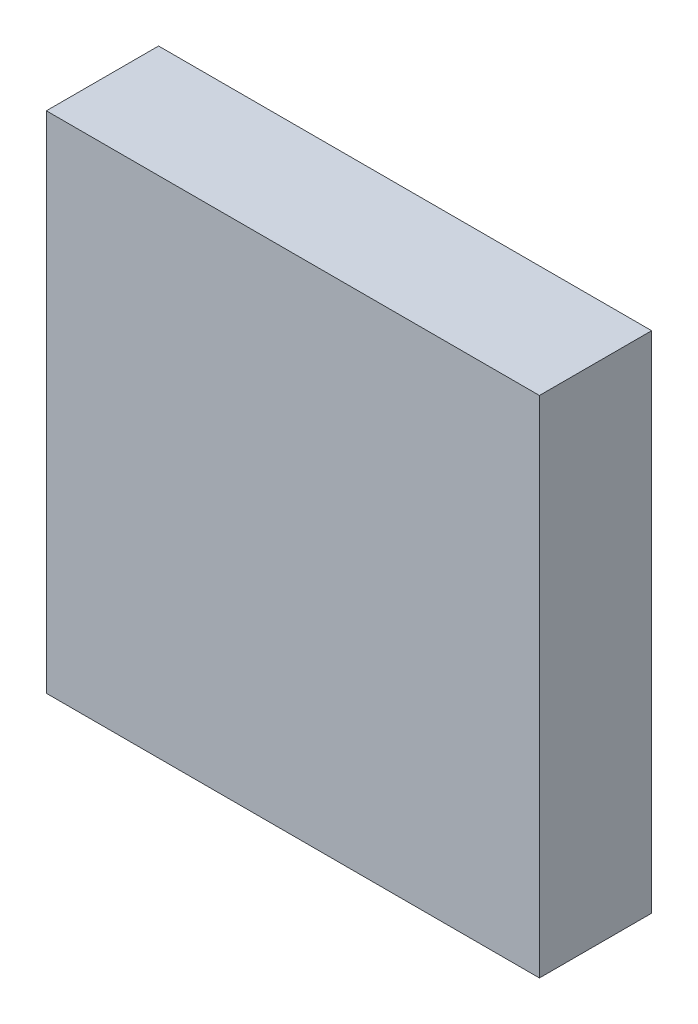
ISO-10303-21;
HEADER;
FILE_DESCRIPTION(('STEP AP214'),'2;1');
FILE_NAME('part.step','',(''),(''),'','','');
FILE_SCHEMA(('AUTOMOTIVE_DESIGN { 1 0 10303 214 1 1 1 1 }'));
ENDSEC;
DATA;
#1=APPLICATION_CONTEXT('core data for automotive mechanical design processes');
#2=APPLICATION_PROTOCOL_DEFINITION('international standard','automotive_design',2000,#1);
#3=PRODUCT_CONTEXT('',#1,'mechanical');
#4=PRODUCT('Part','Part','',(#3));
#5=PRODUCT_RELATED_PRODUCT_CATEGORY('part','',(#4));
#6=PRODUCT_DEFINITION_FORMATION('','',#4);
#7=PRODUCT_DEFINITION_CONTEXT('part definition',#1,'design');
#8=PRODUCT_DEFINITION('design','',#6,#7);
#9=PRODUCT_DEFINITION_SHAPE('','',#8);
#10=(LENGTH_UNIT() NAMED_UNIT(*) SI_UNIT(.MILLI.,.METRE.));
#11=(NAMED_UNIT(*) PLANE_ANGLE_UNIT() SI_UNIT($,.RADIAN.));
#12=(NAMED_UNIT(*) SI_UNIT($,.STERADIAN.) SOLID_ANGLE_UNIT());
#13=UNCERTAINTY_MEASURE_WITH_UNIT(LENGTH_MEASURE(1.E-05),#10,'distance_accuracy_value','');
#14=(GEOMETRIC_REPRESENTATION_CONTEXT(3) GLOBAL_UNCERTAINTY_ASSIGNED_CONTEXT((#13)) GLOBAL_UNIT_ASSIGNED_CONTEXT((#10,
#11,#12)) REPRESENTATION_CONTEXT('',''));
#15=CARTESIAN_POINT('',(0.,0.,0.));
#16=DIRECTION('',(0.,0.,1.));
#17=DIRECTION('',(1.,0.,0.));
#18=AXIS2_PLACEMENT_3D('',#15,#16,#17);
#19=CARTESIAN_POINT('',(-98.,150.,45.));
#20=DIRECTION('',(1.,0.,0.));
#21=DIRECTION('',(0.,1.,0.));
#22=AXIS2_PLACEMENT_3D('',#19,#20,#21);
#23=PLANE('',#22);
#24=DIRECTION('',(0.,-1.,0.));
#25=VECTOR('',#24,1.);
#26=CARTESIAN_POINT('',(-98.,150.,0.));
#27=LINE('',#26,#25);
#28=CARTESIAN_POINT('',(-98.,150.,0.));
#29=VERTEX_POINT('',#28);
#30=CARTESIAN_POINT('',(-98.,-52.3240979213172,0.));
#31=VERTEX_POINT('',#30);
#32=EDGE_CURVE('E95',#29,#31,#27,.T.);
#33=ORIENTED_EDGE('',*,*,#32,.T.);
#34=DIRECTION('',(0.,0.,-1.));
#35=VECTOR('',#34,1.);
#36=CARTESIAN_POINT('',(-98.,-52.3240979213172,45.));
#37=LINE('',#36,#35);
#38=CARTESIAN_POINT('',(-98.,-52.3240979213172,45.));
#39=VERTEX_POINT('',#38);
#40=EDGE_CURVE('E11',#39,#31,#37,.T.);
#41=ORIENTED_EDGE('',*,*,#40,.F.);
#42=DIRECTION('',(0.,-1.,0.));
#43=VECTOR('',#42,1.);
#44=CARTESIAN_POINT('',(-98.,150.,45.));
#45=LINE('',#44,#43);
#46=CARTESIAN_POINT('',(-98.,150.,45.));
#47=VERTEX_POINT('',#46);
#48=EDGE_CURVE('E83',#47,#39,#45,.T.);
#49=ORIENTED_EDGE('',*,*,#48,.F.);
#50=DIRECTION('',(0.,0.,-1.));
#51=VECTOR('',#50,1.);
#52=CARTESIAN_POINT('',(-98.,150.,45.));
#53=LINE('',#52,#51);
#54=EDGE_CURVE('E91',#47,#29,#53,.T.);
#55=ORIENTED_EDGE('',*,*,#54,.T.);
#56=EDGE_LOOP('',(#33,#41,#49,#55));
#57=FACE_BOUND('',#56,.T.);
#58=ADVANCED_FACE('F32',(#57),#23,.F.);
#59=CARTESIAN_POINT('',(-98.,-52.3240979213172,45.));
#60=DIRECTION('',(0.,1.,0.));
#61=DIRECTION('',(0.,0.,1.));
#62=AXIS2_PLACEMENT_3D('',#59,#60,#61);
#63=PLANE('',#62);
#64=DIRECTION('',(1.,0.,0.));
#65=VECTOR('',#64,1.);
#66=CARTESIAN_POINT('',(-98.,-52.3240979213172,0.));
#67=LINE('',#66,#65);
#68=CARTESIAN_POINT('',(99.7508664805407,-52.3240979213172,0.));
#69=VERTEX_POINT('',#68);
#70=EDGE_CURVE('E87',#31,#69,#67,.T.);
#71=ORIENTED_EDGE('',*,*,#70,.T.);
#72=DIRECTION('',(0.,0.,-1.));
#73=VECTOR('',#72,1.);
#74=CARTESIAN_POINT('',(99.7508664805407,-52.3240979213172,45.));
#75=LINE('',#74,#73);
#76=CARTESIAN_POINT('',(99.7508664805407,-52.3240979213172,45.));
#77=VERTEX_POINT('',#76);
#78=EDGE_CURVE('E40',#77,#69,#75,.T.);
#79=ORIENTED_EDGE('',*,*,#78,.F.);
#80=DIRECTION('',(1.,0.,0.));
#81=VECTOR('',#80,1.);
#82=CARTESIAN_POINT('',(-98.,-52.3240979213172,45.));
#83=LINE('',#82,#81);
#84=EDGE_CURVE('E78',#39,#77,#83,.T.);
#85=ORIENTED_EDGE('',*,*,#84,.F.);
#86=ORIENTED_EDGE('',*,*,#40,.T.);
#87=EDGE_LOOP('',(#71,#79,#85,#86));
#88=FACE_BOUND('',#87,.T.);
#89=ADVANCED_FACE('F86',(#88),#63,.F.);
#90=CARTESIAN_POINT('',(99.7508664805407,150.,45.));
#91=DIRECTION('',(-1.,0.,0.));
#92=DIRECTION('',(0.,0.,1.));
#93=AXIS2_PLACEMENT_3D('',#90,#91,#92);
#94=PLANE('',#93);
#95=DIRECTION('',(0.,1.,0.));
#96=VECTOR('',#95,1.);
#97=CARTESIAN_POINT('',(99.7508664805407,150.,0.));
#98=LINE('',#97,#96);
#99=CARTESIAN_POINT('',(99.7508664805407,150.,0.));
#100=VERTEX_POINT('',#99);
#101=EDGE_CURVE('E65',#69,#100,#98,.T.);
#102=ORIENTED_EDGE('',*,*,#101,.T.);
#103=DIRECTION('',(0.,0.,-1.));
#104=VECTOR('',#103,1.);
#105=CARTESIAN_POINT('',(99.7508664805407,150.,45.));
#106=LINE('',#105,#104);
#107=CARTESIAN_POINT('',(99.7508664805407,150.,45.));
#108=VERTEX_POINT('',#107);
#109=EDGE_CURVE('E88',#108,#100,#106,.T.);
#110=ORIENTED_EDGE('',*,*,#109,.F.);
#111=DIRECTION('',(0.,1.,0.));
#112=VECTOR('',#111,1.);
#113=CARTESIAN_POINT('',(99.7508664805407,150.,45.));
#114=LINE('',#113,#112);
#115=EDGE_CURVE('E81',#77,#108,#114,.T.);
#116=ORIENTED_EDGE('',*,*,#115,.F.);
#117=ORIENTED_EDGE('',*,*,#78,.T.);
#118=EDGE_LOOP('',(#102,#110,#116,#117));
#119=FACE_BOUND('',#118,.T.);
#120=ADVANCED_FACE('F89',(#119),#94,.F.);
#121=CARTESIAN_POINT('',(-98.,150.,45.));
#122=DIRECTION('',(0.,-1.,0.));
#123=DIRECTION('',(0.,0.,-1.));
#124=AXIS2_PLACEMENT_3D('',#121,#122,#123);
#125=PLANE('',#124);
#126=DIRECTION('',(-1.,0.,0.));
#127=VECTOR('',#126,1.);
#128=CARTESIAN_POINT('',(-98.,150.,0.));
#129=LINE('',#128,#127);
#130=EDGE_CURVE('E71',#100,#29,#129,.T.);
#131=ORIENTED_EDGE('',*,*,#130,.T.);
#132=ORIENTED_EDGE('',*,*,#54,.F.);
#133=DIRECTION('',(-1.,0.,0.));
#134=VECTOR('',#133,1.);
#135=CARTESIAN_POINT('',(-98.,150.,45.));
#136=LINE('',#135,#134);
#137=EDGE_CURVE('E48',#108,#47,#136,.T.);
#138=ORIENTED_EDGE('',*,*,#137,.F.);
#139=ORIENTED_EDGE('',*,*,#109,.T.);
#140=EDGE_LOOP('',(#131,#132,#138,#139));
#141=FACE_BOUND('',#140,.T.);
#142=ADVANCED_FACE('F102',(#141),#125,.F.);
#143=CARTESIAN_POINT('',(0.,0.,45.));
#144=DIRECTION('',(0.,0.,1.));
#145=DIRECTION('',(1.,0.,0.));
#146=AXIS2_PLACEMENT_3D('',#143,#144,#145);
#147=PLANE('',#146);
#148=ORIENTED_EDGE('',*,*,#48,.T.);
#149=ORIENTED_EDGE('',*,*,#84,.T.);
#150=ORIENTED_EDGE('',*,*,#115,.T.);
#151=ORIENTED_EDGE('',*,*,#137,.T.);
#152=EDGE_LOOP('',(#148,#149,#150,#151));
#153=FACE_BOUND('',#152,.T.);
#154=ADVANCED_FACE('F79',(#153),#147,.T.);
#155=CARTESIAN_POINT('',(0.,0.,0.));
#156=DIRECTION('',(0.,0.,1.));
#157=DIRECTION('',(1.,0.,0.));
#158=AXIS2_PLACEMENT_3D('',#155,#156,#157);
#159=PLANE('',#158);
#160=ORIENTED_EDGE('',*,*,#32,.F.);
#161=ORIENTED_EDGE('',*,*,#130,.F.);
#162=ORIENTED_EDGE('',*,*,#101,.F.);
#163=ORIENTED_EDGE('',*,*,#70,.F.);
#164=EDGE_LOOP('',(#160,#161,#162,#163));
#165=FACE_BOUND('',#164,.T.);
#166=ADVANCED_FACE('F105',(#165),#159,.F.);
#167=CLOSED_SHELL('',(#58,#89,#120,#142,#154,#166));
#168=MANIFOLD_SOLID_BREP('B2',#167);
#169=ADVANCED_BREP_SHAPE_REPRESENTATION('',(#18,#168),#14);
#170=SHAPE_DEFINITION_REPRESENTATION(#9,#169);
ENDSEC;
END-ISO-10303-21;
